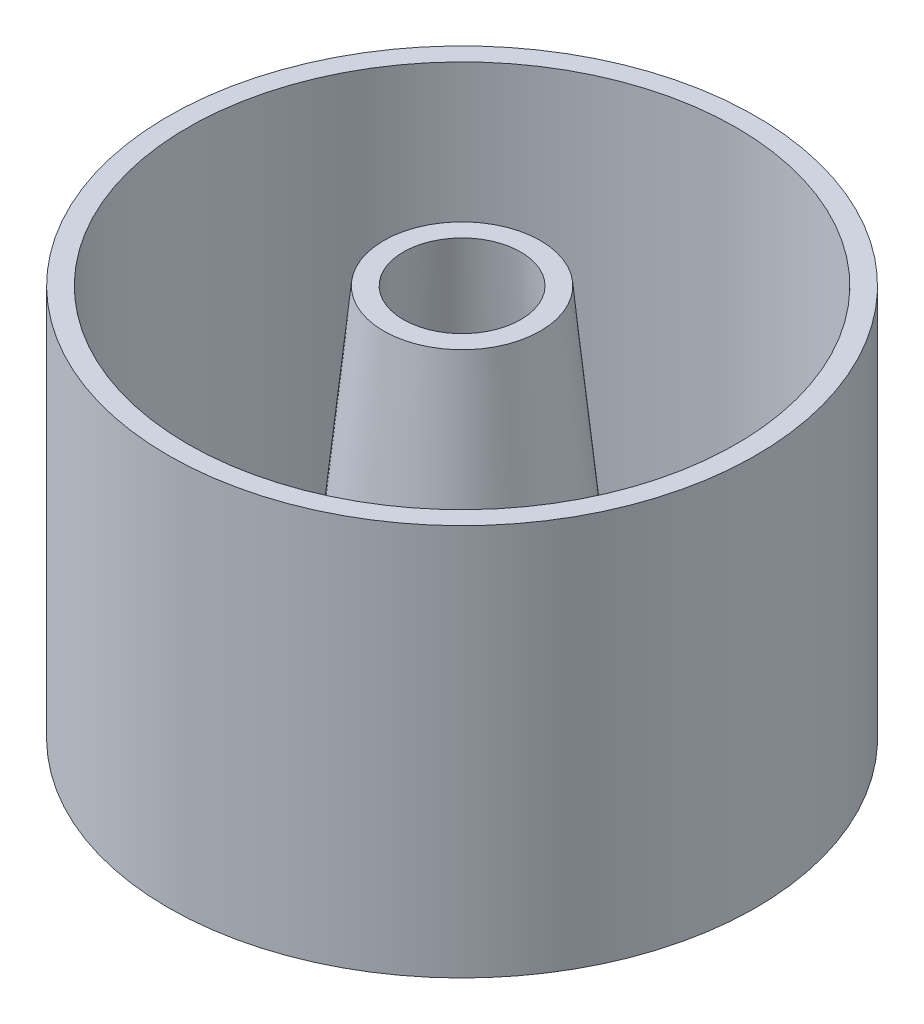
ISO-10303-21;
HEADER;
FILE_DESCRIPTION(('STEP AP214'),'2;1');
FILE_NAME('part.step','',(''),(''),'','','');
FILE_SCHEMA(('AUTOMOTIVE_DESIGN { 1 0 10303 214 1 1 1 1 }'));
ENDSEC;
DATA;
#1=APPLICATION_CONTEXT('core data for automotive mechanical design processes');
#2=APPLICATION_PROTOCOL_DEFINITION('international standard','automotive_design',2000,#1);
#3=PRODUCT_CONTEXT('',#1,'mechanical');
#4=PRODUCT('Part','Part','',(#3));
#5=PRODUCT_RELATED_PRODUCT_CATEGORY('part','',(#4));
#6=PRODUCT_DEFINITION_FORMATION('','',#4);
#7=PRODUCT_DEFINITION_CONTEXT('part definition',#1,'design');
#8=PRODUCT_DEFINITION('design','',#6,#7);
#9=PRODUCT_DEFINITION_SHAPE('','',#8);
#10=(LENGTH_UNIT() NAMED_UNIT(*) SI_UNIT(.MILLI.,.METRE.));
#11=(NAMED_UNIT(*) PLANE_ANGLE_UNIT() SI_UNIT($,.RADIAN.));
#12=(NAMED_UNIT(*) SI_UNIT($,.STERADIAN.) SOLID_ANGLE_UNIT());
#13=UNCERTAINTY_MEASURE_WITH_UNIT(LENGTH_MEASURE(1.E-05),#10,'distance_accuracy_value','');
#14=(GEOMETRIC_REPRESENTATION_CONTEXT(3) GLOBAL_UNCERTAINTY_ASSIGNED_CONTEXT((#13)) GLOBAL_UNIT_ASSIGNED_CONTEXT((#10,
#11,#12)) REPRESENTATION_CONTEXT('',''));
#15=CARTESIAN_POINT('',(0.,0.,0.));
#16=DIRECTION('',(0.,0.,1.));
#17=DIRECTION('',(1.,0.,0.));
#18=AXIS2_PLACEMENT_3D('',#15,#16,#17);
#19=CARTESIAN_POINT('',(0.,100.,0.));
#20=DIRECTION('',(0.,-1.,0.));
#21=DIRECTION('',(0.,0.,-1.));
#22=AXIS2_PLACEMENT_3D('',#19,#20,#21);
#23=CYLINDRICAL_SURFACE('',#22,75.);
#24=CARTESIAN_POINT('',(0.,100.,0.));
#25=DIRECTION('',(0.,1.,0.));
#26=DIRECTION('',(0.,0.,1.));
#27=AXIS2_PLACEMENT_3D('',#24,#25,#26);
#28=CIRCLE('',#27,75.);
#29=CARTESIAN_POINT('',(0.,100.,75.));
#30=VERTEX_POINT('',#29);
#31=EDGE_CURVE('E158',#30,#30,#28,.T.);
#32=ORIENTED_EDGE('',*,*,#31,.F.);
#33=EDGE_LOOP('',(#32));
#34=FACE_BOUND('',#33,.T.);
#35=CARTESIAN_POINT('',(0.,0.,0.));
#36=DIRECTION('',(0.,1.,0.));
#37=DIRECTION('',(0.,0.,1.));
#38=AXIS2_PLACEMENT_3D('',#35,#36,#37);
#39=CIRCLE('',#38,75.);
#40=CARTESIAN_POINT('',(0.,0.,75.));
#41=VERTEX_POINT('',#40);
#42=EDGE_CURVE('E157',#41,#41,#39,.T.);
#43=ORIENTED_EDGE('',*,*,#42,.T.);
#44=EDGE_LOOP('',(#43));
#45=FACE_BOUND('',#44,.T.);
#46=ADVANCED_FACE('F39',(#34,#45),#23,.T.);
#47=CARTESIAN_POINT('',(0.,100.,0.));
#48=DIRECTION('',(0.,1.,0.));
#49=DIRECTION('',(0.,0.,1.));
#50=AXIS2_PLACEMENT_3D('',#47,#48,#49);
#51=PLANE('',#50);
#52=CARTESIAN_POINT('',(0.,100.,0.));
#53=DIRECTION('',(0.,1.,0.));
#54=DIRECTION('',(0.,0.,1.));
#55=AXIS2_PLACEMENT_3D('',#52,#53,#54);
#56=CIRCLE('',#55,70.);
#57=CARTESIAN_POINT('',(0.,100.,70.));
#58=VERTEX_POINT('',#57);
#59=EDGE_CURVE('E154',#58,#58,#56,.T.);
#60=ORIENTED_EDGE('',*,*,#59,.F.);
#61=EDGE_LOOP('',(#60));
#62=FACE_BOUND('',#61,.T.);
#63=ORIENTED_EDGE('',*,*,#31,.T.);
#64=EDGE_LOOP('',(#63));
#65=FACE_BOUND('',#64,.T.);
#66=ADVANCED_FACE('F176',(#62,#65),#51,.T.);
#67=CARTESIAN_POINT('',(0.,0.,0.));
#68=DIRECTION('',(0.,1.,0.));
#69=DIRECTION('',(0.,0.,1.));
#70=AXIS2_PLACEMENT_3D('',#67,#68,#69);
#71=PLANE('',#70);
#72=CARTESIAN_POINT('',(0.,0.,54.6246890528022));
#73=CARTESIAN_POINT('',(-3.57517753797775,0.,54.6246890528022));
#74=CARTESIAN_POINT('',(-7.150266673255,0.,54.272573506741));
#75=CARTESIAN_POINT('',(-14.1632296814293,0.,52.8776084324428));
#76=CARTESIAN_POINT('',(-17.6009301461559,0.,51.8347933972348));
#77=CARTESIAN_POINT('',(-24.2069968510484,0.,49.0984709741198));
#78=CARTESIAN_POINT('',(-27.3751997442604,0.,47.4050312467444));
#79=CARTESIAN_POINT('',(-33.320502707117,0.,43.4325068110166));
#80=CARTESIAN_POINT('',(-36.0974557683847,0.,41.1535203304889));
#81=CARTESIAN_POINT('',(-41.1535203305015,0.,36.0974557683969));
#82=CARTESIAN_POINT('',(-43.4325068110043,0.,33.3205027071107));
#83=CARTESIAN_POINT('',(-47.4050312467568,0.,27.3751997442666));
#84=CARTESIAN_POINT('',(-49.0984709741322,0.,24.2069968510359));
#85=CARTESIAN_POINT('',(-51.8347933972225,0.,17.6009301461682));
#86=CARTESIAN_POINT('',(-52.8776084324429,0.,14.1632296814261));
#87=CARTESIAN_POINT('',(-54.272573506741,0.,7.15026667325798));
#88=CARTESIAN_POINT('',(-54.6246890528022,0.,3.57517753798603));
#89=CARTESIAN_POINT('',(-54.6246890528022,0.,-3.57517753798585));
#90=CARTESIAN_POINT('',(-54.272573506741,0.,-7.15026667325499));
#91=CARTESIAN_POINT('',(-52.8776084324428,0.,-14.1632296814293));
#92=CARTESIAN_POINT('',(-51.8347933972348,0.,-17.6009301461559));
#93=CARTESIAN_POINT('',(-49.0984709741198,0.,-24.2069968510484));
#94=CARTESIAN_POINT('',(-47.4050312467444,0.,-27.3751997442604));
#95=CARTESIAN_POINT('',(-43.4325068110166,0.,-33.320502707117));
#96=CARTESIAN_POINT('',(-41.1535203305022,0.,-36.0974557683839));
#97=CARTESIAN_POINT('',(-36.0974557683839,0.,-41.1535203305021));
#98=CARTESIAN_POINT('',(-33.3205027071068,0.,-43.4325068110029));
#99=CARTESIAN_POINT('',(-27.3751997442704,0.,-47.4050312467583));
#100=CARTESIAN_POINT('',(-24.2069968510426,0.,-49.0984709741282));
#101=CARTESIAN_POINT('',(-17.6009301461615,0.,-51.8347933972265));
#102=CARTESIAN_POINT('',(-14.1632296814278,0.,-52.877608432435));
#103=CARTESIAN_POINT('',(-7.15026667325622,0.,-54.2725735067489));
#104=CARTESIAN_POINT('',(-3.57517753798593,0.,-54.6246890528022));
#105=CARTESIAN_POINT('',(3.57517753798595,0.,-54.6246890528022));
#106=CARTESIAN_POINT('',(7.1502666732594,0.,-54.2725735067364));
#107=CARTESIAN_POINT('',(14.1632296814248,0.,-52.8776084324474));
#108=CARTESIAN_POINT('',(17.6009301461616,0.,-51.8347933972388));
#109=CARTESIAN_POINT('',(24.2069968510427,0.,-49.0984709741157));
#110=CARTESIAN_POINT('',(27.3751997442705,0.,-47.4050312467583));
#111=CARTESIAN_POINT('',(33.3205027071069,0.,-43.4325068110028));
#112=CARTESIAN_POINT('',(36.0974557683963,0.,-41.1535203305022));
#113=CARTESIAN_POINT('',(41.1535203304897,0.,-36.0974557683839));
#114=CARTESIAN_POINT('',(43.4325068110153,0.,-33.3205027071192));
#115=CARTESIAN_POINT('',(47.4050312467459,0.,-27.375199744258));
#116=CARTESIAN_POINT('',(49.098470974124,0.,-24.2069968510455));
#117=CARTESIAN_POINT('',(51.8347933972307,0.,-17.6009301461587));
#118=CARTESIAN_POINT('',(52.8776084324265,0.,-14.1632296814269));
#119=CARTESIAN_POINT('',(54.2725735067573,0.,-7.15026667325711));
#120=CARTESIAN_POINT('',(54.6246890528022,0.,-3.57517753798593));
#121=CARTESIAN_POINT('',(54.6246890528022,0.,3.57517753798594));
#122=CARTESIAN_POINT('',(54.2725735067325,0.,7.15026667325719));
#123=CARTESIAN_POINT('',(52.8776084324513,0.,14.163229681427));
#124=CARTESIAN_POINT('',(51.8347933972307,0.,17.6009301461649));
#125=CARTESIAN_POINT('',(49.098470974124,0.,24.2069968510393));
#126=CARTESIAN_POINT('',(47.4050312467455,0.,27.3751997442648));
#127=CARTESIAN_POINT('',(43.4325068110156,0.,33.3205027071124));
#128=CARTESIAN_POINT('',(41.1535203304927,0.,36.097455768381));
#129=CARTESIAN_POINT('',(36.0974557683934,0.,41.1535203305051));
#130=CARTESIAN_POINT('',(33.3205027071125,0.,43.4325068110156));
#131=CARTESIAN_POINT('',(27.3751997442649,0.,47.4050312467455));
#132=CARTESIAN_POINT('',(24.2069968510441,0.,49.0984709741323));
#133=CARTESIAN_POINT('',(17.6009301461601,0.,51.8347933972224));
#134=CARTESIAN_POINT('',(14.1632296814274,0.,52.8776084324431));
#135=CARTESIAN_POINT('',(7.1502666732567,0.,54.2725735067407));
#136=CARTESIAN_POINT('',(3.57517753797774,0.,54.6246890528022));
#137=CARTESIAN_POINT('',(0.,0.,54.6246890528022));
#138=(BOUNDED_CURVE() B_SPLINE_CURVE(3,(#72,#73,#74,#75,#76,#77,#78,#79,#80,#81,#82,#83,#84,#85,
#86,#87,#88,#89,#90,#91,#92,#93,#94,#95,#96,#97,#98,#99,#100,#101,#102,#103,#104,#105,#106,#107,
#108,#109,#110,#111,#112,#113,#114,#115,#116,#117,#118,#119,#120,#121,#122,#123,#124,#125,#126,
#127,#128,#129,#130,#131,#132,#133,#134,#135,#136,#137),.UNSPECIFIED.,.T.,
.F.) B_SPLINE_CURVE_WITH_KNOTS((4,2,2,2,2,2,2,2,2,2,2,2,2,2,2,2,2,2,2,2,2,2,2,2,2,2,2,2,2,2,2,2,
4),(0.,0.196349540849362,0.392699081698725,0.589048622548086,0.785398163397448,
0.981747704246811,1.17809724509617,1.37444678594553,1.5707963267949,1.76714586764426,
1.96349540849362,2.15984494934298,2.35619449019234,2.55254403104171,2.74889357189107,
2.94524311274043,3.14159265358979,3.33794219443916,3.53429173528852,3.73064127613788,
3.92699081698724,4.1233403578366,4.31968989868597,4.51603943953533,4.71238898038469,
4.90873852123405,5.10508806208341,5.30143760293278,5.49778714378214,5.6941366846315,
5.89048622548086,6.08683576633022,6.28318530717959),
.UNSPECIFIED.) CURVE() GEOMETRIC_REPRESENTATION_ITEM() RATIONAL_B_SPLINE_CURVE((1.,1.,1.,1.,1.,
1.,1.,1.,1.,1.,1.,1.,1.,1.,1.,1.,1.,1.,1.,1.,1.,1.,1.,1.,1.,1.,1.,1.,1.,1.,1.,1.,1.,1.,1.,1.,1.,
1.,1.,1.,1.,1.,1.,1.,1.,1.,1.,1.,1.,1.,1.,1.,1.,1.,1.,1.,1.,1.,1.,1.,1.,1.,1.,1.,1.,1.)) REPRESENTATION_ITEM(''));
#139=CARTESIAN_POINT('',(0.,0.,54.6246890528022));
#140=VERTEX_POINT('',#139);
#141=EDGE_CURVE('E53',#140,#140,#138,.F.);
#142=ORIENTED_EDGE('',*,*,#141,.T.);
#143=EDGE_LOOP('',(#142));
#144=FACE_BOUND('',#143,.T.);
#145=ORIENTED_EDGE('',*,*,#42,.F.);
#146=EDGE_LOOP('',(#145));
#147=FACE_BOUND('',#146,.T.);
#148=ADVANCED_FACE('F166',(#144,#147),#71,.F.);
#149=CARTESIAN_POINT('',(0.,100.,0.));
#150=DIRECTION('',(0.,-1.,0.));
#151=DIRECTION('',(0.,0.,-1.));
#152=AXIS2_PLACEMENT_3D('',#149,#150,#151);
#153=CYLINDRICAL_SURFACE('',#152,70.);
#154=ORIENTED_EDGE('',*,*,#59,.T.);
#155=EDGE_LOOP('',(#154));
#156=FACE_BOUND('',#155,.T.);
#157=CARTESIAN_POINT('',(0.,5.,0.));
#158=DIRECTION('',(0.,1.,0.));
#159=DIRECTION('',(0.,0.,1.));
#160=AXIS2_PLACEMENT_3D('',#157,#158,#159);
#161=CIRCLE('',#160,70.);
#162=CARTESIAN_POINT('',(0.,5.,70.));
#163=VERTEX_POINT('',#162);
#164=EDGE_CURVE('E148',#163,#163,#161,.T.);
#165=ORIENTED_EDGE('',*,*,#164,.F.);
#166=EDGE_LOOP('',(#165));
#167=FACE_BOUND('',#166,.T.);
#168=ADVANCED_FACE('F175',(#156,#167),#153,.F.);
#169=CARTESIAN_POINT('',(0.,5.,0.));
#170=DIRECTION('',(0.,1.,0.));
#171=DIRECTION('',(0.,0.,1.));
#172=AXIS2_PLACEMENT_3D('',#169,#170,#171);
#173=PLANE('',#172);
#174=CARTESIAN_POINT('',(0.,5.,0.));
#175=DIRECTION('',(0.,1.,0.));
#176=DIRECTION('',(0.,0.,1.));
#177=AXIS2_PLACEMENT_3D('',#174,#175,#176);
#178=CIRCLE('',#177,38.5498756211209);
#179=CARTESIAN_POINT('',(0.,5.,38.5498756211209));
#180=VERTEX_POINT('',#179);
#181=EDGE_CURVE('E12',#180,#180,#178,.F.);
#182=ORIENTED_EDGE('',*,*,#181,.T.);
#183=EDGE_LOOP('',(#182));
#184=FACE_BOUND('',#183,.T.);
#185=ORIENTED_EDGE('',*,*,#164,.T.);
#186=EDGE_LOOP('',(#185));
#187=FACE_BOUND('',#186,.T.);
#188=ADVANCED_FACE('F130',(#184,#187),#173,.T.);
#189=CARTESIAN_POINT('',(0.,100.,0.));
#190=DIRECTION('',(0.,1.,0.));
#191=DIRECTION('',(0.,0.,1.));
#192=AXIS2_PLACEMENT_3D('',#189,#190,#191);
#193=PLANE('',#192);
#194=CARTESIAN_POINT('',(0.,100.,0.));
#195=DIRECTION('',(0.,1.,0.));
#196=DIRECTION('',(0.,0.,1.));
#197=AXIS2_PLACEMENT_3D('',#194,#195,#196);
#198=CIRCLE('',#197,14.9750621894396);
#199=CARTESIAN_POINT('',(0.,100.,14.9750621894396));
#200=VERTEX_POINT('',#199);
#201=EDGE_CURVE('E149',#200,#200,#198,.T.);
#202=ORIENTED_EDGE('',*,*,#201,.F.);
#203=EDGE_LOOP('',(#202));
#204=FACE_BOUND('',#203,.T.);
#205=CARTESIAN_POINT('',(0.,100.,0.));
#206=DIRECTION('',(0.,1.,0.));
#207=DIRECTION('',(0.,0.,1.));
#208=AXIS2_PLACEMENT_3D('',#205,#206,#207);
#209=CIRCLE('',#208,20.);
#210=CARTESIAN_POINT('',(0.,100.,20.));
#211=VERTEX_POINT('',#210);
#212=EDGE_CURVE('E141',#211,#211,#209,.T.);
#213=ORIENTED_EDGE('',*,*,#212,.T.);
#214=EDGE_LOOP('',(#213));
#215=FACE_BOUND('',#214,.T.);
#216=ADVANCED_FACE('F126',(#204,#215),#193,.T.);
#217=CARTESIAN_POINT('',(0.,100.,0.));
#218=DIRECTION('',(0.,-1.,0.));
#219=DIRECTION('',(0.,0.,-1.));
#220=AXIS2_PLACEMENT_3D('',#217,#218,#219);
#221=CONICAL_SURFACE('',#220,20.,0.099668652491162);
#222=CARTESIAN_POINT('',(0.,14.00496280979,0.));
#223=DIRECTION('',(0.,-1.,0.));
#224=DIRECTION('',(0.,0.,-1.));
#225=AXIS2_PLACEMENT_3D('',#222,#223,#224);
#226=CIRCLE('',#225,28.599503719021);
#227=CARTESIAN_POINT('',(0.,14.00496280979,-28.599503719021));
#228=VERTEX_POINT('',#227);
#229=EDGE_CURVE('E45',#228,#228,#226,.F.);
#230=ORIENTED_EDGE('',*,*,#229,.T.);
#231=EDGE_LOOP('',(#230));
#232=FACE_BOUND('',#231,.T.);
#233=ORIENTED_EDGE('',*,*,#212,.F.);
#234=EDGE_LOOP('',(#233));
#235=FACE_BOUND('',#234,.T.);
#236=ADVANCED_FACE('F124',(#232,#235),#221,.T.);
#237=CARTESIAN_POINT('',(0.,99.502481404895,0.));
#238=DIRECTION('',(0.,-1.,0.));
#239=DIRECTION('',(0.,0.,-1.));
#240=AXIS2_PLACEMENT_3D('',#237,#238,#239);
#241=CONICAL_SURFACE('',#240,15.0248140489501,0.099668652491162);
#242=CARTESIAN_POINT('',(0.,2.01488842937004,24.7735733465026));
#243=CARTESIAN_POINT('',(1.62142658383364,2.01488842937004,24.7735733465026));
#244=CARTESIAN_POINT('',(3.24281307497669,2.01488842937039,24.6138807156059));
#245=CARTESIAN_POINT('',(6.42335572834202,2.01488842936968,23.9812314468731));
#246=CARTESIAN_POINT('',(7.98243324590873,2.01488842937034,23.5082904524326));
#247=CARTESIAN_POINT('',(10.9784389144671,2.01488842936974,22.2673042715691));
#248=CARTESIAN_POINT('',(12.415292983805,2.01488842936994,21.4992897707714));
#249=CARTESIAN_POINT('',(15.1116268498842,2.01488842937013,19.6976570807589));
#250=CARTESIAN_POINT('',(16.3710399749111,2.0148884293696,18.6640834401575));
#251=CARTESIAN_POINT('',(18.6640834401575,2.01488842937047,16.371039974911));
#252=CARTESIAN_POINT('',(19.697657080759,2.01488842936936,15.1116268498843));
#253=CARTESIAN_POINT('',(21.4992897707713,2.01488842937071,12.415292983805));
#254=CARTESIAN_POINT('',(22.2673042715686,2.01488842937009,10.9784389144682));
#255=CARTESIAN_POINT('',(23.5082904524331,2.01488842936998,7.98243324590759));
#256=CARTESIAN_POINT('',(23.9812314468738,2.01488842936945,6.42335572833887));
#257=CARTESIAN_POINT('',(24.6138807156053,2.01488842937062,3.24281307497988));
#258=CARTESIAN_POINT('',(24.7735733465026,2.01488842937004,1.62142658383736));
#259=CARTESIAN_POINT('',(24.7735733465026,2.01488842937004,-1.62142658383736));
#260=CARTESIAN_POINT('',(24.6138807156064,2.01488842936835,-3.24281307497544));
#261=CARTESIAN_POINT('',(23.9812314468726,2.01488842937173,-6.42335572834323));
#262=CARTESIAN_POINT('',(23.508290452431,2.01488842937043,-7.98243324591243));
#263=CARTESIAN_POINT('',(22.2673042715707,2.01488842936964,-10.9784389144634));
#264=CARTESIAN_POINT('',(21.4992897707707,2.01488842937054,-12.415292983806));
#265=CARTESIAN_POINT('',(19.6976570807596,2.01488842936953,-15.1116268498832));
#266=CARTESIAN_POINT('',(18.6640834401628,2.01488842937231,-16.3710399749054));
#267=CARTESIAN_POINT('',(16.3710399749057,2.01488842936777,-18.6640834401631));
#268=CARTESIAN_POINT('',(15.1116268498817,2.01488842937192,-19.6976570807604));
#269=CARTESIAN_POINT('',(12.4152929838076,2.01488842936815,-21.4992897707699));
#270=CARTESIAN_POINT('',(10.9784389144703,2.01488842937052,-22.2673042715677));
#271=CARTESIAN_POINT('',(7.98243324590556,2.01488842936955,-23.508290452434));
#272=CARTESIAN_POINT('',(6.42335572833985,2.01488842936953,-23.9812314468736));
#273=CARTESIAN_POINT('',(3.2428130749789,2.01488842937054,-24.6138807156055));
#274=CARTESIAN_POINT('',(1.62142658383736,2.01488842937004,-24.7735733465026));
#275=CARTESIAN_POINT('',(-1.62142658383736,2.01488842937004,-24.7735733465026));
#276=CARTESIAN_POINT('',(-3.24281307497619,2.01488842936997,-24.613880715606));
#277=CARTESIAN_POINT('',(-6.42335572834248,2.0148884293701,-23.981231446873));
#278=CARTESIAN_POINT('',(-7.98243324591031,2.01488842937,-23.508290452432));
#279=CARTESIAN_POINT('',(-10.9784389144654,2.01488842937007,-22.2673042715698));
#280=CARTESIAN_POINT('',(-12.4152929838075,2.01488842936892,-21.4992897707699));
#281=CARTESIAN_POINT('',(-15.1116268498817,2.01488842937115,-19.6976570807605));
#282=CARTESIAN_POINT('',(-16.3710399749056,2.01488842937047,-18.6640834401629));
#283=CARTESIAN_POINT('',(-18.664083440163,2.0148884293696,-16.3710399749056));
#284=CARTESIAN_POINT('',(-19.6976570807569,2.01488842936886,-15.1116268498874));
#285=CARTESIAN_POINT('',(-21.4992897707733,2.01488842937122,-12.4152929838019));
#286=CARTESIAN_POINT('',(-22.2673042715685,2.01488842937023,-10.9784389144683));
#287=CARTESIAN_POINT('',(-23.5082904524331,2.01488842936985,-7.98243324590755));
#288=CARTESIAN_POINT('',(-23.9812314468729,2.01488842937025,-6.42335572834263));
#289=CARTESIAN_POINT('',(-24.6138807156061,2.01488842936982,-3.24281307497614));
#290=CARTESIAN_POINT('',(-24.7735733465026,2.01488842937004,-1.62142658383732));
#291=CARTESIAN_POINT('',(-24.7735733465026,2.01488842937004,1.6214265838374));
#292=CARTESIAN_POINT('',(-24.6138807156055,2.0148884293704,3.24281307497875));
#293=CARTESIAN_POINT('',(-23.9812314468735,2.01488842936968,6.42335572833991));
#294=CARTESIAN_POINT('',(-23.50829045243,2.01488842937018,7.98243324591495));
#295=CARTESIAN_POINT('',(-22.2673042715717,2.0148884293699,10.9784389144608));
#296=CARTESIAN_POINT('',(-21.4992897707725,2.01488842937037,12.4152929838034));
#297=CARTESIAN_POINT('',(-19.6976570807578,2.01488842936971,15.1116268498859));
#298=CARTESIAN_POINT('',(-18.6640834401598,2.01488842937047,16.3710399749087));
#299=CARTESIAN_POINT('',(-16.3710399749089,2.0148884293696,18.6640834401597));
#300=CARTESIAN_POINT('',(-15.1116268498859,2.01488842936971,19.6976570807578));
#301=CARTESIAN_POINT('',(-12.4152929838034,2.01488842937037,21.4992897707724));
#302=CARTESIAN_POINT('',(-10.9784389144705,2.01488842937003,22.2673042715677));
#303=CARTESIAN_POINT('',(-7.98243324590535,2.01488842937005,23.508290452434));
#304=CARTESIAN_POINT('',(-6.42335572834263,2.01488842937025,23.9812314468729));
#305=CARTESIAN_POINT('',(-3.24281307497614,2.01488842936982,24.6138807156061));
#306=CARTESIAN_POINT('',(-1.62142658383364,2.01488842937004,24.7735733465026));
#307=CARTESIAN_POINT('',(0.,2.01488842937004,24.7735733465026));
#308=(BOUNDED_CURVE() B_SPLINE_CURVE(3,(#242,#243,#244,#245,#246,#247,#248,#249,#250,#251,#252,
#253,#254,#255,#256,#257,#258,#259,#260,#261,#262,#263,#264,#265,#266,#267,#268,#269,#270,#271,
#272,#273,#274,#275,#276,#277,#278,#279,#280,#281,#282,#283,#284,#285,#286,#287,#288,#289,#290,
#291,#292,#293,#294,#295,#296,#297,#298,#299,#300,#301,#302,#303,#304,#305,#306,#307),
.UNSPECIFIED.,.T.,.F.) B_SPLINE_CURVE_WITH_KNOTS((4,2,2,2,2,2,2,2,2,2,2,2,2,2,2,2,2,2,2,2,2,2,2,
2,2,2,2,2,2,2,2,2,4),(0.,0.196349540849362,0.392699081698724,0.589048622548086,
0.785398163397448,0.98174770424681,1.17809724509617,1.37444678594553,1.5707963267949,
1.76714586764426,1.96349540849362,2.15984494934298,2.35619449019234,2.55254403104171,
2.74889357189107,2.94524311274043,3.14159265358979,3.33794219443916,3.53429173528852,
3.73064127613788,3.92699081698724,4.1233403578366,4.31968989868597,4.51603943953533,
4.71238898038469,4.90873852123405,5.10508806208341,5.30143760293278,5.49778714378214,
5.6941366846315,5.89048622548086,6.08683576633022,6.28318530717959),
.UNSPECIFIED.) CURVE() GEOMETRIC_REPRESENTATION_ITEM() RATIONAL_B_SPLINE_CURVE((1.,1.,1.,1.,1.,
1.,1.,1.,1.,1.,1.,1.,1.,1.,1.,1.,1.,1.,1.,1.,1.,1.,1.,1.,1.,1.,1.,1.,1.,1.,1.,1.,1.,1.,1.,1.,1.,
1.,1.,1.,1.,1.,1.,1.,1.,1.,1.,1.,1.,1.,1.,1.,1.,1.,1.,1.,1.,1.,1.,1.,1.,1.,1.,1.,1.,1.)) REPRESENTATION_ITEM(''));
#309=CARTESIAN_POINT('',(0.,2.01488842937004,24.7735733465026));
#310=VERTEX_POINT('',#309);
#311=EDGE_CURVE('E49',#310,#310,#308,.F.);
#312=ORIENTED_EDGE('',*,*,#311,.T.);
#313=EDGE_LOOP('',(#312));
#314=FACE_BOUND('',#313,.T.);
#315=ORIENTED_EDGE('',*,*,#201,.T.);
#316=EDGE_LOOP('',(#315));
#317=FACE_BOUND('',#316,.T.);
#318=ADVANCED_FACE('F74',(#314,#317),#241,.F.);
#319=CARTESIAN_POINT('',(0.,0.,54.6246890528022));
#320=CARTESIAN_POINT('',(3.57517753797774,0.,54.6246890528022));
#321=CARTESIAN_POINT('',(7.1502666732567,0.,54.2725735067407));
#322=CARTESIAN_POINT('',(14.1632296814274,0.,52.8776084324431));
#323=CARTESIAN_POINT('',(17.6009301461601,0.,51.8347933972224));
#324=CARTESIAN_POINT('',(24.2069968510441,0.,49.0984709741323));
#325=CARTESIAN_POINT('',(27.3751997442649,0.,47.4050312467455));
#326=CARTESIAN_POINT('',(33.3205027071125,0.,43.4325068110156));
#327=CARTESIAN_POINT('',(36.0974557683934,0.,41.1535203305051));
#328=CARTESIAN_POINT('',(41.1535203304927,0.,36.097455768381));
#329=CARTESIAN_POINT('',(43.4325068110156,0.,33.3205027071124));
#330=CARTESIAN_POINT('',(47.4050312467455,0.,27.3751997442648));
#331=CARTESIAN_POINT('',(49.098470974124,0.,24.2069968510393));
#332=CARTESIAN_POINT('',(51.8347933972307,0.,17.6009301461649));
#333=CARTESIAN_POINT('',(52.8776084324513,0.,14.163229681427));
#334=CARTESIAN_POINT('',(54.2725735067325,0.,7.15026667325719));
#335=CARTESIAN_POINT('',(54.6246890528022,0.,3.57517753798594));
#336=CARTESIAN_POINT('',(54.6246890528022,0.,-3.57517753798593));
#337=CARTESIAN_POINT('',(54.2725735067573,0.,-7.15026667325711));
#338=CARTESIAN_POINT('',(52.8776084324265,0.,-14.1632296814269));
#339=CARTESIAN_POINT('',(51.8347933972307,0.,-17.6009301461587));
#340=CARTESIAN_POINT('',(49.098470974124,0.,-24.2069968510455));
#341=CARTESIAN_POINT('',(47.4050312467459,0.,-27.375199744258));
#342=CARTESIAN_POINT('',(43.4325068110153,0.,-33.3205027071192));
#343=CARTESIAN_POINT('',(41.1535203304897,0.,-36.0974557683839));
#344=CARTESIAN_POINT('',(36.0974557683963,0.,-41.1535203305022));
#345=CARTESIAN_POINT('',(33.3205027071069,0.,-43.4325068110028));
#346=CARTESIAN_POINT('',(27.3751997442705,0.,-47.4050312467583));
#347=CARTESIAN_POINT('',(24.2069968510427,0.,-49.0984709741157));
#348=CARTESIAN_POINT('',(17.6009301461616,0.,-51.8347933972388));
#349=CARTESIAN_POINT('',(14.1632296814248,0.,-52.8776084324474));
#350=CARTESIAN_POINT('',(7.1502666732594,0.,-54.2725735067364));
#351=CARTESIAN_POINT('',(3.57517753798595,0.,-54.6246890528022));
#352=CARTESIAN_POINT('',(-3.57517753798593,0.,-54.6246890528022));
#353=CARTESIAN_POINT('',(-7.15026667325622,0.,-54.2725735067489));
#354=CARTESIAN_POINT('',(-14.1632296814278,0.,-52.877608432435));
#355=CARTESIAN_POINT('',(-17.6009301461615,0.,-51.8347933972265));
#356=CARTESIAN_POINT('',(-24.2069968510426,0.,-49.0984709741282));
#357=CARTESIAN_POINT('',(-27.3751997442704,0.,-47.4050312467583));
#358=CARTESIAN_POINT('',(-33.3205027071068,0.,-43.4325068110029));
#359=CARTESIAN_POINT('',(-36.0974557683839,0.,-41.1535203305021));
#360=CARTESIAN_POINT('',(-41.1535203305022,0.,-36.0974557683839));
#361=CARTESIAN_POINT('',(-43.4325068110166,0.,-33.320502707117));
#362=CARTESIAN_POINT('',(-47.4050312467444,0.,-27.3751997442604));
#363=CARTESIAN_POINT('',(-49.0984709741198,0.,-24.2069968510484));
#364=CARTESIAN_POINT('',(-51.8347933972348,0.,-17.6009301461559));
#365=CARTESIAN_POINT('',(-52.8776084324428,0.,-14.1632296814293));
#366=CARTESIAN_POINT('',(-54.272573506741,0.,-7.15026667325499));
#367=CARTESIAN_POINT('',(-54.6246890528022,0.,-3.57517753798585));
#368=CARTESIAN_POINT('',(-54.6246890528022,0.,3.57517753798603));
#369=CARTESIAN_POINT('',(-54.272573506741,0.,7.15026667325798));
#370=CARTESIAN_POINT('',(-52.8776084324429,0.,14.1632296814261));
#371=CARTESIAN_POINT('',(-51.8347933972225,0.,17.6009301461682));
#372=CARTESIAN_POINT('',(-49.0984709741322,0.,24.2069968510359));
#373=CARTESIAN_POINT('',(-47.4050312467568,0.,27.3751997442666));
#374=CARTESIAN_POINT('',(-43.4325068110043,0.,33.3205027071107));
#375=CARTESIAN_POINT('',(-41.1535203305015,0.,36.0974557683969));
#376=CARTESIAN_POINT('',(-36.0974557683847,0.,41.1535203304889));
#377=CARTESIAN_POINT('',(-33.320502707117,0.,43.4325068110166));
#378=CARTESIAN_POINT('',(-27.3751997442604,0.,47.4050312467444));
#379=CARTESIAN_POINT('',(-24.2069968510484,0.,49.0984709741198));
#380=CARTESIAN_POINT('',(-17.6009301461559,0.,51.8347933972348));
#381=CARTESIAN_POINT('',(-14.1632296814293,0.,52.8776084324428));
#382=CARTESIAN_POINT('',(-7.150266673255,0.,54.272573506741));
#383=CARTESIAN_POINT('',(-3.57517753797775,0.,54.6246890528022));
#384=CARTESIAN_POINT('',(0.,0.,54.6246890528022));
#385=CARTESIAN_POINT('',(0.,0.,24.9750621894396));
#386=CARTESIAN_POINT('',(1.63461399776519,4.69699479595107E-12,24.9750621894396));
#387=CARTESIAN_POINT('',(3.26918757675783,0.,24.8140707437532));
#388=CARTESIAN_POINT('',(6.47559827306335,0.,24.176276001362));
#389=CARTESIAN_POINT('',(8.04735610609143,0.,23.699488475284));
#390=CARTESIAN_POINT('',(11.0677289382812,0.,22.4484090847554));
#391=CARTESIAN_POINT('',(12.5162692532709,8.22160957039489E-11,21.6741481555049));
#392=CARTESIAN_POINT('',(15.2345329872611,-8.2135431062316E-11,19.8578623962656));
#393=CARTESIAN_POINT('',(16.5041891922677,-7.71339922963321E-13,18.8158824771492));
#394=CARTESIAN_POINT('',(18.8158824771492,7.79146178605216E-13,16.5041891922677));
#395=CARTESIAN_POINT('',(19.8578623962594,7.68304156880357E-13,15.2345329872611));
#396=CARTESIAN_POINT('',(21.6741481555111,-7.82181944688172E-13,12.5162692532708));
#397=CARTESIAN_POINT('',(22.4484090847579,3.72628407804119E-11,11.067728938281));
#398=CARTESIAN_POINT('',(23.6994884752816,-3.71604920953292E-11,8.04735610609156));
#399=CARTESIAN_POINT('',(24.1762760013662,7.13262638004062E-11,6.47559827306224));
#400=CARTESIAN_POINT('',(24.814070743749,-7.13184575447643E-11,3.26918757675898));
#401=CARTESIAN_POINT('',(24.9750621894396,0.,1.63461399776894));
#402=CARTESIAN_POINT('',(24.9750621894396,0.,-1.63461399776894));
#403=CARTESIAN_POINT('',(24.8140707437676,-1.54658297375699E-12,-3.26918757675895));
#404=CARTESIAN_POINT('',(24.1762760013476,1.55438922939889E-12,-6.4755982730622));
#405=CARTESIAN_POINT('',(23.6994884752692,-1.55009578879585E-11,-8.04735610608538));
#406=CARTESIAN_POINT('',(22.4484090847702,1.55087641436003E-11,-11.0677289382872));
#407=CARTESIAN_POINT('',(21.6741481555242,-5.89483958392076E-11,-12.5162692532791));
#408=CARTESIAN_POINT('',(19.8578623962464,5.88885478792866E-11,-15.2345329872529));
#409=CARTESIAN_POINT('',(18.815882477136,-7.7133992295862E-13,-16.5041891922437));
#410=CARTESIAN_POINT('',(16.5041891922809,7.79146178600516E-13,-18.8158824771732));
#411=CARTESIAN_POINT('',(15.2345329872467,2.24859516004284E-11,-19.8578623962463));
#412=CARTESIAN_POINT('',(12.5162692532853,-2.24781453447865E-11,-21.6741481555242));
#413=CARTESIAN_POINT('',(11.0677289382876,-1.54658297373818E-12,-22.4484090847592));
#414=CARTESIAN_POINT('',(8.04735610608512,1.55438922938008E-12,-23.6994884752802));
#415=CARTESIAN_POINT('',(6.47559827305985,7.36498245475348E-11,-24.1762760013453));
#416=CARTESIAN_POINT('',(3.26918757676137,-7.3646355100583E-11,-24.8140707437699));
#417=CARTESIAN_POINT('',(1.63461399776894,0.,-24.9750621894396));
#418=CARTESIAN_POINT('',(-1.63461399776894,0.,-24.9750621894396));
#419=CARTESIAN_POINT('',(-3.26918757675823,-3.8337145287364E-12,-24.8140707437513));
#420=CARTESIAN_POINT('',(-6.47559827306291,3.91871597905926E-12,-24.1762760013639));
#421=CARTESIAN_POINT('',(-8.04735610608505,-1.54922842703905E-11,-23.6994884752678));
#422=CARTESIAN_POINT('',(-11.0677289382875,1.55174377607922E-11,-22.4484090847717));
#423=CARTESIAN_POINT('',(-12.5162692532791,0.,-21.6741481555242));
#424=CARTESIAN_POINT('',(-15.2345329872529,0.,-19.8578623962464));
#425=CARTESIAN_POINT('',(-16.5041891922623,0.,-18.8158824771608));
#426=CARTESIAN_POINT('',(-18.8158824771546,0.,-16.5041891922561));
#427=CARTESIAN_POINT('',(-19.8578623962615,2.01602224485787E-11,-15.2345329872673));
#428=CARTESIAN_POINT('',(-21.674148155509,-2.01524161929367E-11,-12.5162692532648));
#429=CARTESIAN_POINT('',(-22.4484090847627,0.,-11.067728938287));
#430=CARTESIAN_POINT('',(-23.6994884752768,0.,-8.04735610608569));
#431=CARTESIAN_POINT('',(-24.1762760013438,0.,-6.47559827306154));
#432=CARTESIAN_POINT('',(-24.8140707437714,0.,-3.26918757675971));
#433=CARTESIAN_POINT('',(-24.9750621894396,0.,-1.6346139977689));
#434=CARTESIAN_POINT('',(-24.9750621894396,0.,1.63461399776898));
#435=CARTESIAN_POINT('',(-24.8140707437528,-7.67043928995326E-11,3.2691875767581));
#436=CARTESIAN_POINT('',(-24.1762760013624,7.67937311585454E-11,6.47559827306304));
#437=CARTESIAN_POINT('',(-23.6994884752706,-1.55009578881465E-11,8.04735610609183));
#438=CARTESIAN_POINT('',(-22.4484090847689,1.55087641437884E-11,11.0677289382807));
#439=CARTESIAN_POINT('',(-21.6741481555152,1.55438922941769E-12,12.5162692532709));
#440=CARTESIAN_POINT('',(-19.8578623962553,-1.5465829737758E-12,15.234532987261));
#441=CARTESIAN_POINT('',(-18.8158824771455,7.80447221226304E-13,16.504189192259));
#442=CARTESIAN_POINT('',(-16.5041891922715,-7.70038880370444E-13,18.8158824771578));
#443=CARTESIAN_POINT('',(-15.2345329872611,1.52056212163615E-12,19.8578623962553));
#444=CARTESIAN_POINT('',(-12.516269253271,-1.58041008155734E-12,21.6741481555152));
#445=CARTESIAN_POINT('',(-11.067728938287,-7.78712497750324E-13,22.4484090847565));
#446=CARTESIAN_POINT('',(-8.0473561060857,7.7177360384642E-13,23.699488475283));
#447=CARTESIAN_POINT('',(-6.47559827306154,-1.5465829737758E-12,24.1762760013438));
#448=CARTESIAN_POINT('',(-3.26918757675971,1.5543892294177E-12,24.8140707437714));
#449=CARTESIAN_POINT('',(-1.63461399776519,-4.6059218134623E-12,24.9750621894396));
#450=CARTESIAN_POINT('',(0.,0.,24.9750621894396));
#451=CARTESIAN_POINT('',(0.,2.01488842937004,24.7735733465026));
#452=CARTESIAN_POINT('',(1.62142658383364,2.01488842937004,24.7735733465026));
#453=CARTESIAN_POINT('',(3.24281307497669,2.01488842937039,24.6138807156059));
#454=CARTESIAN_POINT('',(6.42335572834202,2.01488842936968,23.9812314468731));
#455=CARTESIAN_POINT('',(7.98243324590873,2.01488842937034,23.5082904524326));
#456=CARTESIAN_POINT('',(10.9784389144671,2.01488842936974,22.2673042715691));
#457=CARTESIAN_POINT('',(12.415292983805,2.01488842936994,21.4992897707714));
#458=CARTESIAN_POINT('',(15.1116268498842,2.01488842937013,19.6976570807589));
#459=CARTESIAN_POINT('',(16.3710399749111,2.0148884293696,18.6640834401575));
#460=CARTESIAN_POINT('',(18.6640834401575,2.01488842937047,16.371039974911));
#461=CARTESIAN_POINT('',(19.697657080759,2.01488842936936,15.1116268498843));
#462=CARTESIAN_POINT('',(21.4992897707713,2.01488842937071,12.415292983805));
#463=CARTESIAN_POINT('',(22.2673042715686,2.01488842937009,10.9784389144682));
#464=CARTESIAN_POINT('',(23.5082904524331,2.01488842936998,7.98243324590759));
#465=CARTESIAN_POINT('',(23.9812314468738,2.01488842936945,6.42335572833887));
#466=CARTESIAN_POINT('',(24.6138807156053,2.01488842937062,3.24281307497988));
#467=CARTESIAN_POINT('',(24.7735733465026,2.01488842937004,1.62142658383736));
#468=CARTESIAN_POINT('',(24.7735733465026,2.01488842937004,-1.62142658383736));
#469=CARTESIAN_POINT('',(24.6138807156064,2.01488842936835,-3.24281307497544));
#470=CARTESIAN_POINT('',(23.9812314468726,2.01488842937173,-6.42335572834323));
#471=CARTESIAN_POINT('',(23.508290452431,2.01488842937043,-7.98243324591243));
#472=CARTESIAN_POINT('',(22.2673042715707,2.01488842936964,-10.9784389144634));
#473=CARTESIAN_POINT('',(21.4992897707707,2.01488842937054,-12.415292983806));
#474=CARTESIAN_POINT('',(19.6976570807596,2.01488842936953,-15.1116268498832));
#475=CARTESIAN_POINT('',(18.6640834401628,2.01488842937231,-16.3710399749054));
#476=CARTESIAN_POINT('',(16.3710399749057,2.01488842936777,-18.6640834401631));
#477=CARTESIAN_POINT('',(15.1116268498817,2.01488842937192,-19.6976570807604));
#478=CARTESIAN_POINT('',(12.4152929838076,2.01488842936815,-21.4992897707699));
#479=CARTESIAN_POINT('',(10.9784389144703,2.01488842937052,-22.2673042715677));
#480=CARTESIAN_POINT('',(7.98243324590556,2.01488842936955,-23.508290452434));
#481=CARTESIAN_POINT('',(6.42335572833985,2.01488842936953,-23.9812314468736));
#482=CARTESIAN_POINT('',(3.2428130749789,2.01488842937054,-24.6138807156055));
#483=CARTESIAN_POINT('',(1.62142658383736,2.01488842937004,-24.7735733465026));
#484=CARTESIAN_POINT('',(-1.62142658383736,2.01488842937004,-24.7735733465026));
#485=CARTESIAN_POINT('',(-3.24281307497619,2.01488842936997,-24.613880715606));
#486=CARTESIAN_POINT('',(-6.42335572834248,2.0148884293701,-23.981231446873));
#487=CARTESIAN_POINT('',(-7.98243324591031,2.01488842937,-23.508290452432));
#488=CARTESIAN_POINT('',(-10.9784389144654,2.01488842937007,-22.2673042715698));
#489=CARTESIAN_POINT('',(-12.4152929838075,2.01488842936892,-21.4992897707699));
#490=CARTESIAN_POINT('',(-15.1116268498817,2.01488842937115,-19.6976570807605));
#491=CARTESIAN_POINT('',(-16.3710399749056,2.01488842937047,-18.6640834401629));
#492=CARTESIAN_POINT('',(-18.664083440163,2.0148884293696,-16.3710399749056));
#493=CARTESIAN_POINT('',(-19.6976570807569,2.01488842936886,-15.1116268498874));
#494=CARTESIAN_POINT('',(-21.4992897707733,2.01488842937122,-12.4152929838019));
#495=CARTESIAN_POINT('',(-22.2673042715685,2.01488842937023,-10.9784389144683));
#496=CARTESIAN_POINT('',(-23.5082904524331,2.01488842936985,-7.98243324590755));
#497=CARTESIAN_POINT('',(-23.9812314468729,2.01488842937025,-6.42335572834263));
#498=CARTESIAN_POINT('',(-24.6138807156061,2.01488842936982,-3.24281307497614));
#499=CARTESIAN_POINT('',(-24.7735733465026,2.01488842937004,-1.62142658383732));
#500=CARTESIAN_POINT('',(-24.7735733465026,2.01488842937004,1.6214265838374));
#501=CARTESIAN_POINT('',(-24.6138807156055,2.0148884293704,3.24281307497875));
#502=CARTESIAN_POINT('',(-23.9812314468735,2.01488842936968,6.42335572833991));
#503=CARTESIAN_POINT('',(-23.50829045243,2.01488842937018,7.98243324591495));
#504=CARTESIAN_POINT('',(-22.2673042715717,2.0148884293699,10.9784389144608));
#505=CARTESIAN_POINT('',(-21.4992897707725,2.01488842937037,12.4152929838034));
#506=CARTESIAN_POINT('',(-19.6976570807578,2.01488842936971,15.1116268498859));
#507=CARTESIAN_POINT('',(-18.6640834401598,2.01488842937047,16.3710399749087));
#508=CARTESIAN_POINT('',(-16.3710399749089,2.0148884293696,18.6640834401597));
#509=CARTESIAN_POINT('',(-15.1116268498859,2.01488842936971,19.6976570807578));
#510=CARTESIAN_POINT('',(-12.4152929838034,2.01488842937037,21.4992897707724));
#511=CARTESIAN_POINT('',(-10.9784389144705,2.01488842937003,22.2673042715677));
#512=CARTESIAN_POINT('',(-7.98243324590535,2.01488842937005,23.508290452434));
#513=CARTESIAN_POINT('',(-6.42335572834263,2.01488842937025,23.9812314468729));
#514=CARTESIAN_POINT('',(-3.24281307497614,2.01488842936982,24.6138807156061));
#515=CARTESIAN_POINT('',(-1.62142658383364,2.01488842937004,24.7735733465026));
#516=CARTESIAN_POINT('',(0.,2.01488842937004,24.7735733465026));
#517=(BOUNDED_SURFACE() B_SPLINE_SURFACE(2,3,((#319,#320,#321,#322,#323,#324,#325,#326,#327,
#328,#329,#330,#331,#332,#333,#334,#335,#336,#337,#338,#339,#340,#341,#342,#343,#344,#345,#346,
#347,#348,#349,#350,#351,#352,#353,#354,#355,#356,#357,#358,#359,#360,#361,#362,#363,#364,#365,
#366,#367,#368,#369,#370,#371,#372,#373,#374,#375,#376,#377,#378,#379,#380,#381,#382,#383,#384),
(#385,#386,#387,#388,#389,#390,#391,#392,#393,#394,#395,#396,#397,#398,#399,#400,#401,#402,#403,
#404,#405,#406,#407,#408,#409,#410,#411,#412,#413,#414,#415,#416,#417,#418,#419,#420,#421,#422,
#423,#424,#425,#426,#427,#428,#429,#430,#431,#432,#433,#434,#435,#436,#437,#438,#439,#440,#441,
#442,#443,#444,#445,#446,#447,#448,#449,#450),(#451,#452,#453,#454,#455,#456,#457,#458,#459,
#460,#461,#462,#463,#464,#465,#466,#467,#468,#469,#470,#471,#472,#473,#474,#475,#476,#477,#478,
#479,#480,#481,#482,#483,#484,#485,#486,#487,#488,#489,#490,#491,#492,#493,#494,#495,#496,#497,
#498,#499,#500,#501,#502,#503,#504,#505,#506,#507,#508,#509,#510,#511,#512,#513,#514,#515,
#516)),.UNSPECIFIED.,.F.,.T.,.F.) B_SPLINE_SURFACE_WITH_KNOTS((3,3),(4,2,2,2,2,2,2,2,2,2,2,2,2,
2,2,2,2,2,2,2,2,2,2,2,2,2,2,2,2,2,2,2,4),(0.,1.),(0.,0.196349540849362,0.392699081698724,
0.589048622548086,0.785398163397448,0.98174770424681,1.17809724509617,1.37444678594553,
1.5707963267949,1.76714586764426,1.96349540849362,2.15984494934298,2.35619449019234,
2.55254403104171,2.74889357189107,2.94524311274043,3.14159265358979,3.33794219443916,
3.53429173528852,3.73064127613788,3.92699081698724,4.1233403578366,4.31968989868597,
4.51603943953533,4.71238898038469,4.90873852123405,5.10508806208341,5.30143760293278,
5.49778714378214,5.6941366846315,5.89048622548086,6.08683576633022,6.28318530717959),
.UNSPECIFIED.) GEOMETRIC_REPRESENTATION_ITEM() RATIONAL_B_SPLINE_SURFACE(((1.,1.,1.,1.,1.,1.,1.,
1.,1.,1.,1.,1.,1.,1.,1.,1.,1.,1.,1.,1.,1.,1.,1.,1.,1.,1.,1.,1.,1.,1.,1.,1.,1.,1.,1.,1.,1.,1.,1.,
1.,1.,1.,1.,1.,1.,1.,1.,1.,1.,1.,1.,1.,1.,1.,1.,1.,1.,1.,1.,1.,1.,1.,1.,1.,1.,1.),
(0.741452533551879,0.741452533551879,0.741452533551878,0.741452533551878,0.741452533551878,
0.741452533551878,0.741452533551879,0.741452533551879,0.741452533551878,0.741452533551878,
0.741452533551878,0.741452533551878,0.741452533551879,0.741452533551879,0.741452533551878,
0.741452533551878,0.741452533551879,0.741452533551879,0.741452533551878,0.741452533551878,
0.741452533551878,0.741452533551878,0.741452533551878,0.741452533551878,0.741452533551878,
0.741452533551878,0.741452533551878,0.741452533551878,0.741452533551878,0.741452533551878,
0.741452533551878,0.741452533551878,0.741452533551879,0.741452533551879,0.741452533551879,
0.741452533551879,0.741452533551879,0.741452533551879,0.741452533551878,0.741452533551878,
0.741452533551878,0.741452533551878,0.741452533551878,0.741452533551878,0.741452533551878,
0.741452533551878,0.741452533551878,0.741452533551878,0.741452533551879,0.741452533551879,
0.741452533551879,0.741452533551879,0.741452533551878,0.741452533551878,0.741452533551878,
0.741452533551878,0.741452533551878,0.741452533551878,0.741452533551878,0.741452533551878,
0.741452533551878,0.741452533551878,0.741452533551878,0.741452533551878,0.741452533551879,
0.741452533551879),(1.,1.,1.,1.,1.,1.,1.,1.,1.,1.,1.,1.,1.,1.,1.,1.,1.,1.,1.,1.,1.,1.,1.,1.,1.,
1.,1.,1.,1.,1.,1.,1.,1.,1.,1.,1.,1.,1.,1.,1.,1.,1.,1.,1.,1.,1.,1.,1.,1.,1.,1.,1.,1.,1.,1.,1.,1.,
1.,1.,1.,1.,1.,1.,1.,1.,1.))) REPRESENTATION_ITEM('') SURFACE());
#518=ORIENTED_EDGE('',*,*,#311,.F.);
#519=EDGE_LOOP('',(#518));
#520=FACE_BOUND('',#519,.T.);
#521=ORIENTED_EDGE('',*,*,#141,.F.);
#522=EDGE_LOOP('',(#521));
#523=FACE_BOUND('',#522,.T.);
#524=ADVANCED_FACE('F61',(#520,#523),#517,.T.);
#525=CARTESIAN_POINT('',(0.,15.,0.));
#526=DIRECTION('',(0.,1.,0.));
#527=DIRECTION('',(0.,0.,1.));
#528=AXIS2_PLACEMENT_3D('',#525,#526,#527);
#529=TOROIDAL_SURFACE('',#528,38.5498756211209,10.);
#530=ORIENTED_EDGE('',*,*,#181,.F.);
#531=EDGE_LOOP('',(#530));
#532=FACE_BOUND('',#531,.T.);
#533=ORIENTED_EDGE('',*,*,#229,.F.);
#534=EDGE_LOOP('',(#533));
#535=FACE_BOUND('',#534,.T.);
#536=ADVANCED_FACE('F41',(#532,#535),#529,.F.);
#537=CLOSED_SHELL('',(#46,#66,#148,#168,#188,#216,#236,#318,#524,#536));
#538=MANIFOLD_SOLID_BREP('B2',#537);
#539=ADVANCED_BREP_SHAPE_REPRESENTATION('',(#18,#538),#14);
#540=SHAPE_DEFINITION_REPRESENTATION(#9,#539);
ENDSEC;
END-ISO-10303-21;
